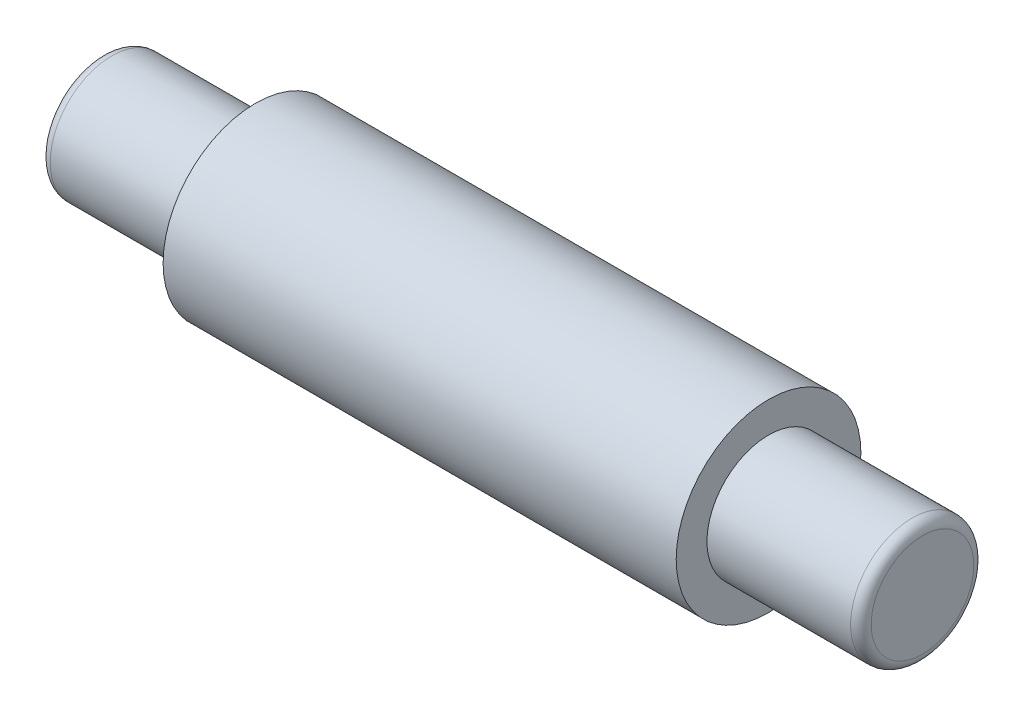
ISO-10303-21;
HEADER;
FILE_DESCRIPTION(('STEP AP214'),'2;1');
FILE_NAME('part.step','',(''),(''),'','','');
FILE_SCHEMA(('AUTOMOTIVE_DESIGN { 1 0 10303 214 1 1 1 1 }'));
ENDSEC;
DATA;
#1=APPLICATION_CONTEXT('core data for automotive mechanical design processes');
#2=APPLICATION_PROTOCOL_DEFINITION('international standard','automotive_design',2000,#1);
#3=PRODUCT_CONTEXT('',#1,'mechanical');
#4=PRODUCT('Part','Part','',(#3));
#5=PRODUCT_RELATED_PRODUCT_CATEGORY('part','',(#4));
#6=PRODUCT_DEFINITION_FORMATION('','',#4);
#7=PRODUCT_DEFINITION_CONTEXT('part definition',#1,'design');
#8=PRODUCT_DEFINITION('design','',#6,#7);
#9=PRODUCT_DEFINITION_SHAPE('','',#8);
#10=(LENGTH_UNIT() NAMED_UNIT(*) SI_UNIT(.MILLI.,.METRE.));
#11=(NAMED_UNIT(*) PLANE_ANGLE_UNIT() SI_UNIT($,.RADIAN.));
#12=(NAMED_UNIT(*) SI_UNIT($,.STERADIAN.) SOLID_ANGLE_UNIT());
#13=UNCERTAINTY_MEASURE_WITH_UNIT(LENGTH_MEASURE(1.E-05),#10,'distance_accuracy_value','');
#14=(GEOMETRIC_REPRESENTATION_CONTEXT(3) GLOBAL_UNCERTAINTY_ASSIGNED_CONTEXT((#13)) GLOBAL_UNIT_ASSIGNED_CONTEXT((#10,
#11,#12)) REPRESENTATION_CONTEXT('',''));
#15=CARTESIAN_POINT('',(0.,0.,0.));
#16=DIRECTION('',(0.,0.,1.));
#17=DIRECTION('',(1.,0.,0.));
#18=AXIS2_PLACEMENT_3D('',#15,#16,#17);
#19=CARTESIAN_POINT('',(50.,0.,0.));
#20=DIRECTION('',(-1.,0.,0.));
#21=DIRECTION('',(0.,0.,1.));
#22=AXIS2_PLACEMENT_3D('',#19,#20,#21);
#23=CYLINDRICAL_SURFACE('',#22,9.);
#24=CARTESIAN_POINT('',(50.,0.,0.));
#25=DIRECTION('',(1.,0.,0.));
#26=DIRECTION('',(0.,0.,-1.));
#27=AXIS2_PLACEMENT_3D('',#24,#25,#26);
#28=CIRCLE('',#27,9.);
#29=CARTESIAN_POINT('',(50.,0.,-9.));
#30=VERTEX_POINT('',#29);
#31=EDGE_CURVE('E72',#30,#30,#28,.T.);
#32=ORIENTED_EDGE('',*,*,#31,.F.);
#33=EDGE_LOOP('',(#32));
#34=FACE_BOUND('',#33,.T.);
#35=CARTESIAN_POINT('',(0.,0.,0.));
#36=DIRECTION('',(1.,0.,0.));
#37=DIRECTION('',(0.,0.,-1.));
#38=AXIS2_PLACEMENT_3D('',#35,#36,#37);
#39=CIRCLE('',#38,9.);
#40=CARTESIAN_POINT('',(0.,0.,-9.));
#41=VERTEX_POINT('',#40);
#42=EDGE_CURVE('E68',#41,#41,#39,.T.);
#43=ORIENTED_EDGE('',*,*,#42,.T.);
#44=EDGE_LOOP('',(#43));
#45=FACE_BOUND('',#44,.T.);
#46=ADVANCED_FACE('F41',(#34,#45),#23,.T.);
#47=CARTESIAN_POINT('',(50.,0.,0.));
#48=DIRECTION('',(1.,0.,0.));
#49=DIRECTION('',(0.,0.,-1.));
#50=AXIS2_PLACEMENT_3D('',#47,#48,#49);
#51=PLANE('',#50);
#52=CARTESIAN_POINT('',(50.,0.,0.));
#53=DIRECTION('',(1.,0.,0.));
#54=DIRECTION('',(0.,0.,-1.));
#55=AXIS2_PLACEMENT_3D('',#52,#53,#54);
#56=CIRCLE('',#55,6.);
#57=CARTESIAN_POINT('',(50.,0.,-6.));
#58=VERTEX_POINT('',#57);
#59=EDGE_CURVE('E76',#58,#58,#56,.T.);
#60=ORIENTED_EDGE('',*,*,#59,.F.);
#61=EDGE_LOOP('',(#60));
#62=FACE_BOUND('',#61,.T.);
#63=ORIENTED_EDGE('',*,*,#31,.T.);
#64=EDGE_LOOP('',(#63));
#65=FACE_BOUND('',#64,.T.);
#66=ADVANCED_FACE('F91',(#62,#65),#51,.T.);
#67=CARTESIAN_POINT('',(0.,0.,0.));
#68=DIRECTION('',(1.,0.,0.));
#69=DIRECTION('',(0.,0.,-1.));
#70=AXIS2_PLACEMENT_3D('',#67,#68,#69);
#71=PLANE('',#70);
#72=CARTESIAN_POINT('',(0.,0.,0.));
#73=DIRECTION('',(-1.,0.,0.));
#74=DIRECTION('',(0.,0.,1.));
#75=AXIS2_PLACEMENT_3D('',#72,#73,#74);
#76=CIRCLE('',#75,6.);
#77=CARTESIAN_POINT('',(0.,0.,6.));
#78=VERTEX_POINT('',#77);
#79=EDGE_CURVE('E67',#78,#78,#76,.T.);
#80=ORIENTED_EDGE('',*,*,#79,.F.);
#81=EDGE_LOOP('',(#80));
#82=FACE_BOUND('',#81,.T.);
#83=ORIENTED_EDGE('',*,*,#42,.F.);
#84=EDGE_LOOP('',(#83));
#85=FACE_BOUND('',#84,.T.);
#86=ADVANCED_FACE('F87',(#82,#85),#71,.F.);
#87=CARTESIAN_POINT('',(65.,0.,0.));
#88=DIRECTION('',(-1.,0.,0.));
#89=DIRECTION('',(0.,0.,1.));
#90=AXIS2_PLACEMENT_3D('',#87,#88,#89);
#91=CYLINDRICAL_SURFACE('',#90,6.);
#92=CARTESIAN_POINT('',(64.,0.,0.));
#93=DIRECTION('',(1.,0.,0.));
#94=DIRECTION('',(0.,0.,-1.));
#95=AXIS2_PLACEMENT_3D('',#92,#93,#94);
#96=CIRCLE('',#95,6.);
#97=CARTESIAN_POINT('',(64.,0.,-6.));
#98=VERTEX_POINT('',#97);
#99=EDGE_CURVE('E10',#98,#98,#96,.F.);
#100=ORIENTED_EDGE('',*,*,#99,.T.);
#101=EDGE_LOOP('',(#100));
#102=FACE_BOUND('',#101,.T.);
#103=ORIENTED_EDGE('',*,*,#59,.T.);
#104=EDGE_LOOP('',(#103));
#105=FACE_BOUND('',#104,.T.);
#106=ADVANCED_FACE('F90',(#102,#105),#91,.T.);
#107=CARTESIAN_POINT('',(65.,0.,0.));
#108=DIRECTION('',(1.,0.,0.));
#109=DIRECTION('',(0.,0.,-1.));
#110=AXIS2_PLACEMENT_3D('',#107,#108,#109);
#111=PLANE('',#110);
#112=CARTESIAN_POINT('',(65.,0.,0.));
#113=DIRECTION('',(1.,0.,0.));
#114=DIRECTION('',(0.,0.,-1.));
#115=AXIS2_PLACEMENT_3D('',#112,#113,#114);
#116=CIRCLE('',#115,5.);
#117=CARTESIAN_POINT('',(65.,0.,-5.));
#118=VERTEX_POINT('',#117);
#119=EDGE_CURVE('E49',#118,#118,#116,.T.);
#120=ORIENTED_EDGE('',*,*,#119,.T.);
#121=EDGE_LOOP('',(#120));
#122=FACE_BOUND('',#121,.T.);
#123=ADVANCED_FACE('F120',(#122),#111,.T.);
#124=CARTESIAN_POINT('',(-15.,0.,0.));
#125=DIRECTION('',(1.,0.,0.));
#126=DIRECTION('',(0.,0.,-1.));
#127=AXIS2_PLACEMENT_3D('',#124,#125,#126);
#128=CYLINDRICAL_SURFACE('',#127,6.);
#129=CARTESIAN_POINT('',(-14.,0.,0.));
#130=DIRECTION('',(-1.,0.,0.));
#131=DIRECTION('',(0.,0.,1.));
#132=AXIS2_PLACEMENT_3D('',#129,#130,#131);
#133=CIRCLE('',#132,6.);
#134=CARTESIAN_POINT('',(-14.,0.,6.));
#135=VERTEX_POINT('',#134);
#136=EDGE_CURVE('E55',#135,#135,#133,.F.);
#137=ORIENTED_EDGE('',*,*,#136,.T.);
#138=EDGE_LOOP('',(#137));
#139=FACE_BOUND('',#138,.T.);
#140=ORIENTED_EDGE('',*,*,#79,.T.);
#141=EDGE_LOOP('',(#140));
#142=FACE_BOUND('',#141,.T.);
#143=ADVANCED_FACE('F85',(#139,#142),#128,.T.);
#144=CARTESIAN_POINT('',(-15.,0.,0.));
#145=DIRECTION('',(-1.,0.,0.));
#146=DIRECTION('',(0.,0.,1.));
#147=AXIS2_PLACEMENT_3D('',#144,#145,#146);
#148=PLANE('',#147);
#149=CARTESIAN_POINT('',(-15.,0.,0.));
#150=DIRECTION('',(-1.,0.,0.));
#151=DIRECTION('',(0.,0.,1.));
#152=AXIS2_PLACEMENT_3D('',#149,#150,#151);
#153=CIRCLE('',#152,5.);
#154=CARTESIAN_POINT('',(-15.,0.,5.));
#155=VERTEX_POINT('',#154);
#156=EDGE_CURVE('E61',#155,#155,#153,.T.);
#157=ORIENTED_EDGE('',*,*,#156,.T.);
#158=EDGE_LOOP('',(#157));
#159=FACE_BOUND('',#158,.T.);
#160=ADVANCED_FACE('F106',(#159),#148,.T.);
#161=CARTESIAN_POINT('',(-14.,0.,0.));
#162=DIRECTION('',(-1.,0.,0.));
#163=DIRECTION('',(0.,0.,1.));
#164=AXIS2_PLACEMENT_3D('',#161,#162,#163);
#165=TOROIDAL_SURFACE('',#164,5.,1.);
#166=ORIENTED_EDGE('',*,*,#136,.F.);
#167=EDGE_LOOP('',(#166));
#168=FACE_BOUND('',#167,.T.);
#169=ORIENTED_EDGE('',*,*,#156,.F.);
#170=EDGE_LOOP('',(#169));
#171=FACE_BOUND('',#170,.T.);
#172=ADVANCED_FACE('F104',(#168,#171),#165,.T.);
#173=CARTESIAN_POINT('',(64.,0.,0.));
#174=DIRECTION('',(1.,0.,0.));
#175=DIRECTION('',(0.,0.,-1.));
#176=AXIS2_PLACEMENT_3D('',#173,#174,#175);
#177=TOROIDAL_SURFACE('',#176,5.,1.);
#178=ORIENTED_EDGE('',*,*,#99,.F.);
#179=EDGE_LOOP('',(#178));
#180=FACE_BOUND('',#179,.T.);
#181=ORIENTED_EDGE('',*,*,#119,.F.);
#182=EDGE_LOOP('',(#181));
#183=FACE_BOUND('',#182,.T.);
#184=ADVANCED_FACE('F43',(#180,#183),#177,.T.);
#185=CLOSED_SHELL('',(#46,#66,#86,#106,#123,#143,#160,#172,#184));
#186=MANIFOLD_SOLID_BREP('B2',#185);
#187=ADVANCED_BREP_SHAPE_REPRESENTATION('',(#18,#186),#14);
#188=SHAPE_DEFINITION_REPRESENTATION(#9,#187);
ENDSEC;
END-ISO-10303-21;
